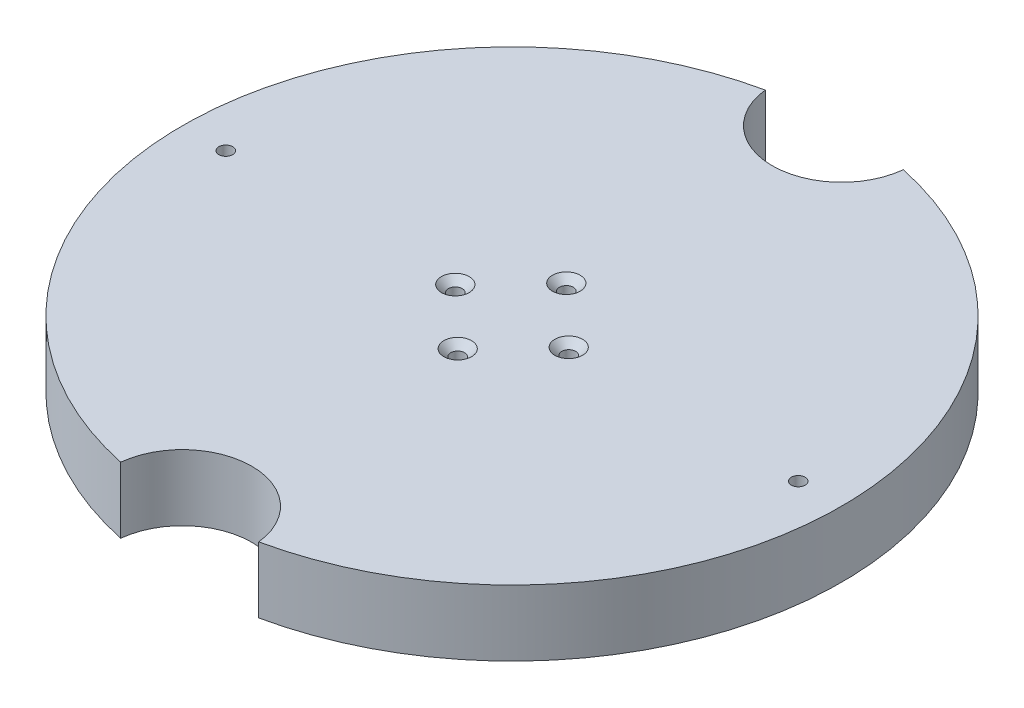
ISO-10303-21;
HEADER;
FILE_DESCRIPTION(('STEP AP214'),'2;1');
FILE_NAME('part.step','',(''),(''),'','','');
FILE_SCHEMA(('AUTOMOTIVE_DESIGN { 1 0 10303 214 1 1 1 1 }'));
ENDSEC;
DATA;
#1=APPLICATION_CONTEXT('core data for automotive mechanical design processes');
#2=APPLICATION_PROTOCOL_DEFINITION('international standard','automotive_design',2000,#1);
#3=PRODUCT_CONTEXT('',#1,'mechanical');
#4=PRODUCT('Part','Part','',(#3));
#5=PRODUCT_RELATED_PRODUCT_CATEGORY('part','',(#4));
#6=PRODUCT_DEFINITION_FORMATION('','',#4);
#7=PRODUCT_DEFINITION_CONTEXT('part definition',#1,'design');
#8=PRODUCT_DEFINITION('design','',#6,#7);
#9=PRODUCT_DEFINITION_SHAPE('','',#8);
#10=(LENGTH_UNIT() NAMED_UNIT(*) SI_UNIT(.MILLI.,.METRE.));
#11=(NAMED_UNIT(*) PLANE_ANGLE_UNIT() SI_UNIT($,.RADIAN.));
#12=(NAMED_UNIT(*) SI_UNIT($,.STERADIAN.) SOLID_ANGLE_UNIT());
#13=UNCERTAINTY_MEASURE_WITH_UNIT(LENGTH_MEASURE(1.E-05),#10,'distance_accuracy_value','');
#14=(GEOMETRIC_REPRESENTATION_CONTEXT(3) GLOBAL_UNCERTAINTY_ASSIGNED_CONTEXT((#13)) GLOBAL_UNIT_ASSIGNED_CONTEXT((#10,
#11,#12)) REPRESENTATION_CONTEXT('',''));
#15=CARTESIAN_POINT('',(0.,0.,0.));
#16=DIRECTION('',(0.,0.,1.));
#17=DIRECTION('',(1.,0.,0.));
#18=AXIS2_PLACEMENT_3D('',#15,#16,#17);
#19=CARTESIAN_POINT('',(0.,9.5,0.));
#20=DIRECTION('',(0.,-1.,0.));
#21=DIRECTION('',(0.,0.,-1.));
#22=AXIS2_PLACEMENT_3D('',#19,#20,#21);
#23=CYLINDRICAL_SURFACE('',#22,47.5);
#24=DIRECTION('',(0.,1.,0.));
#25=VECTOR('',#24,1.);
#26=CARTESIAN_POINT('',(-9.9444440145743,4.75,46.4473684210526));
#27=LINE('',#26,#25);
#28=CARTESIAN_POINT('',(-9.94444401457429,9.5,46.4473684210526));
#29=VERTEX_POINT('',#28);
#30=CARTESIAN_POINT('',(-9.94444401457432,0.,46.4473684210526));
#31=VERTEX_POINT('',#30);
#32=EDGE_CURVE('E57',#29,#31,#27,.F.);
#33=ORIENTED_EDGE('',*,*,#32,.F.);
#34=CARTESIAN_POINT('',(0.,9.5,0.));
#35=DIRECTION('',(0.,1.,0.));
#36=DIRECTION('',(0.,0.,1.));
#37=AXIS2_PLACEMENT_3D('',#34,#35,#36);
#38=CIRCLE('',#37,47.5);
#39=CARTESIAN_POINT('',(-9.94444401457429,9.5,-46.4473684210526));
#40=VERTEX_POINT('',#39);
#41=EDGE_CURVE('E111',#40,#29,#38,.T.);
#42=ORIENTED_EDGE('',*,*,#41,.F.);
#43=DIRECTION('',(0.,1.,0.));
#44=VECTOR('',#43,1.);
#45=CARTESIAN_POINT('',(-9.9444440145743,4.75,-46.4473684210526));
#46=LINE('',#45,#44);
#47=CARTESIAN_POINT('',(-9.94444401457429,0.,-46.4473684210526));
#48=VERTEX_POINT('',#47);
#49=EDGE_CURVE('E107',#40,#48,#46,.F.);
#50=ORIENTED_EDGE('',*,*,#49,.T.);
#51=CARTESIAN_POINT('',(0.,0.,0.));
#52=DIRECTION('',(0.,1.,0.));
#53=DIRECTION('',(0.,0.,1.));
#54=AXIS2_PLACEMENT_3D('',#51,#52,#53);
#55=CIRCLE('',#54,47.5);
#56=EDGE_CURVE('E102',#48,#31,#55,.T.);
#57=ORIENTED_EDGE('',*,*,#56,.T.);
#58=EDGE_LOOP('',(#33,#42,#50,#57));
#59=FACE_BOUND('',#58,.T.);
#60=ADVANCED_FACE('F40',(#59),#23,.T.);
#61=DIRECTION('',(0.,1.,0.));
#62=VECTOR('',#61,1.);
#63=CARTESIAN_POINT('',(9.9444440145743,4.75,46.4473684210526));
#64=LINE('',#63,#62);
#65=CARTESIAN_POINT('',(9.94444401457429,0.,46.4473684210526));
#66=VERTEX_POINT('',#65);
#67=CARTESIAN_POINT('',(9.94444401457429,9.5,46.4473684210526));
#68=VERTEX_POINT('',#67);
#69=EDGE_CURVE('E84',#66,#68,#64,.T.);
#70=ORIENTED_EDGE('',*,*,#69,.F.);
#71=CARTESIAN_POINT('',(9.94444401457432,0.,-46.4473684210526));
#72=VERTEX_POINT('',#71);
#73=EDGE_CURVE('E65',#66,#72,#55,.T.);
#74=ORIENTED_EDGE('',*,*,#73,.T.);
#75=DIRECTION('',(0.,1.,0.));
#76=VECTOR('',#75,1.);
#77=CARTESIAN_POINT('',(9.9444440145743,4.75,-46.4473684210526));
#78=LINE('',#77,#76);
#79=CARTESIAN_POINT('',(9.94444401457429,9.5,-46.4473684210526));
#80=VERTEX_POINT('',#79);
#81=EDGE_CURVE('E103',#72,#80,#78,.T.);
#82=ORIENTED_EDGE('',*,*,#81,.T.);
#83=EDGE_CURVE('E95',#68,#80,#38,.T.);
#84=ORIENTED_EDGE('',*,*,#83,.F.);
#85=EDGE_LOOP('',(#70,#74,#82,#84));
#86=FACE_BOUND('',#85,.T.);
#87=ADVANCED_FACE('F94',(#86),#23,.T.);
#88=CARTESIAN_POINT('',(0.,9.5,0.));
#89=DIRECTION('',(0.,1.,0.));
#90=DIRECTION('',(0.,0.,1.));
#91=AXIS2_PLACEMENT_3D('',#88,#89,#90);
#92=PLANE('',#91);
#93=CARTESIAN_POINT('',(41.25,9.5,0.));
#94=DIRECTION('',(0.,-1.,0.));
#95=DIRECTION('',(0.,0.,1.));
#96=AXIS2_PLACEMENT_3D('',#93,#94,#95);
#97=CIRCLE('',#96,0.999999999999998);
#98=CARTESIAN_POINT('',(41.25,9.5,0.999999999999998));
#99=VERTEX_POINT('',#98);
#100=EDGE_CURVE('E242',#99,#99,#97,.T.);
#101=ORIENTED_EDGE('',*,*,#100,.T.);
#102=EDGE_LOOP('',(#101));
#103=FACE_BOUND('',#102,.T.);
#104=CARTESIAN_POINT('',(-41.25,9.5,0.));
#105=DIRECTION('',(0.,1.,0.));
#106=DIRECTION('',(0.,0.,1.));
#107=AXIS2_PLACEMENT_3D('',#104,#105,#106);
#108=CIRCLE('',#107,0.999999999999998);
#109=CARTESIAN_POINT('',(-41.25,9.5,0.999999999999998));
#110=VERTEX_POINT('',#109);
#111=EDGE_CURVE('E119',#110,#110,#108,.T.);
#112=ORIENTED_EDGE('',*,*,#111,.F.);
#113=EDGE_LOOP('',(#112));
#114=FACE_BOUND('',#113,.T.);
#115=CARTESIAN_POINT('',(-7.99813720015753,9.5,0.172630609847427));
#116=DIRECTION('',(0.,1.,0.));
#117=DIRECTION('',(0.,0.,1.));
#118=AXIS2_PLACEMENT_3D('',#115,#116,#117);
#119=CIRCLE('',#118,2.00000000000006);
#120=CARTESIAN_POINT('',(-7.99813720015753,9.5,2.17263060984749));
#121=VERTEX_POINT('',#120);
#122=EDGE_CURVE('E146',#121,#121,#119,.F.);
#123=ORIENTED_EDGE('',*,*,#122,.T.);
#124=EDGE_LOOP('',(#123));
#125=FACE_BOUND('',#124,.T.);
#126=CARTESIAN_POINT('',(0.172630609847433,9.5,7.99813720015753));
#127=DIRECTION('',(0.,1.,0.));
#128=DIRECTION('',(0.,0.,1.));
#129=AXIS2_PLACEMENT_3D('',#126,#127,#128);
#130=CIRCLE('',#129,2.00000000000003);
#131=CARTESIAN_POINT('',(0.172630609847433,9.5,9.99813720015756));
#132=VERTEX_POINT('',#131);
#133=EDGE_CURVE('E142',#132,#132,#130,.F.);
#134=ORIENTED_EDGE('',*,*,#133,.T.);
#135=EDGE_LOOP('',(#134));
#136=FACE_BOUND('',#135,.T.);
#137=CARTESIAN_POINT('',(7.99813720015753,9.5,-0.172630609847428));
#138=DIRECTION('',(0.,1.,0.));
#139=DIRECTION('',(0.,0.,1.));
#140=AXIS2_PLACEMENT_3D('',#137,#138,#139);
#141=CIRCLE('',#140,1.99999999999997);
#142=CARTESIAN_POINT('',(7.99813720015753,9.5,1.82736939015255));
#143=VERTEX_POINT('',#142);
#144=EDGE_CURVE('E138',#143,#143,#141,.F.);
#145=ORIENTED_EDGE('',*,*,#144,.T.);
#146=EDGE_LOOP('',(#145));
#147=FACE_BOUND('',#146,.T.);
#148=CARTESIAN_POINT('',(-0.172630609847428,9.5,-7.99813720015753));
#149=DIRECTION('',(0.,1.,0.));
#150=DIRECTION('',(0.,0.,1.));
#151=AXIS2_PLACEMENT_3D('',#148,#149,#150);
#152=CIRCLE('',#151,2.00000000000004);
#153=CARTESIAN_POINT('',(-0.172630609847428,9.5,-5.99813720015749));
#154=VERTEX_POINT('',#153);
#155=EDGE_CURVE('E134',#154,#154,#152,.F.);
#156=ORIENTED_EDGE('',*,*,#155,.T.);
#157=EDGE_LOOP('',(#156));
#158=FACE_BOUND('',#157,.T.);
#159=ORIENTED_EDGE('',*,*,#41,.T.);
#160=CARTESIAN_POINT('',(0.,9.5,47.5));
#161=DIRECTION('',(0.,-1.,0.));
#162=DIRECTION('',(0.,0.,-1.));
#163=AXIS2_PLACEMENT_3D('',#160,#161,#162);
#164=CIRCLE('',#163,9.99999999999999);
#165=EDGE_CURVE('E97',#29,#68,#164,.T.);
#166=ORIENTED_EDGE('',*,*,#165,.T.);
#167=ORIENTED_EDGE('',*,*,#83,.T.);
#168=CARTESIAN_POINT('',(0.,9.5,-47.5));
#169=DIRECTION('',(0.,1.,0.));
#170=DIRECTION('',(0.,0.,1.));
#171=AXIS2_PLACEMENT_3D('',#168,#169,#170);
#172=CIRCLE('',#171,9.99999999999999);
#173=EDGE_CURVE('E252',#40,#80,#172,.T.);
#174=ORIENTED_EDGE('',*,*,#173,.F.);
#175=EDGE_LOOP('',(#159,#166,#167,#174));
#176=FACE_BOUND('',#175,.T.);
#177=ADVANCED_FACE('F191',(#103,#114,#125,#136,#147,#158,#176),#92,.T.);
#178=CARTESIAN_POINT('',(0.,0.,0.));
#179=DIRECTION('',(0.,1.,0.));
#180=DIRECTION('',(0.,0.,1.));
#181=AXIS2_PLACEMENT_3D('',#178,#179,#180);
#182=PLANE('',#181);
#183=CARTESIAN_POINT('',(41.25,0.,0.));
#184=DIRECTION('',(0.,1.,0.));
#185=DIRECTION('',(0.,0.,1.));
#186=AXIS2_PLACEMENT_3D('',#183,#184,#185);
#187=CIRCLE('',#186,2.00000000000002);
#188=CARTESIAN_POINT('',(41.25,0.,2.00000000000002));
#189=VERTEX_POINT('',#188);
#190=EDGE_CURVE('E50',#189,#189,#187,.T.);
#191=ORIENTED_EDGE('',*,*,#190,.T.);
#192=EDGE_LOOP('',(#191));
#193=FACE_BOUND('',#192,.T.);
#194=CARTESIAN_POINT('',(-41.25,0.,0.));
#195=DIRECTION('',(0.,1.,0.));
#196=DIRECTION('',(0.,0.,1.));
#197=AXIS2_PLACEMENT_3D('',#194,#195,#196);
#198=CIRCLE('',#197,2.00000000000002);
#199=CARTESIAN_POINT('',(-41.25,0.,2.00000000000002));
#200=VERTEX_POINT('',#199);
#201=EDGE_CURVE('E166',#200,#200,#198,.T.);
#202=ORIENTED_EDGE('',*,*,#201,.T.);
#203=EDGE_LOOP('',(#202));
#204=FACE_BOUND('',#203,.T.);
#205=CARTESIAN_POINT('',(-7.99813720015753,0.,0.172630609847426));
#206=DIRECTION('',(0.,1.,0.));
#207=DIRECTION('',(0.,0.,1.));
#208=AXIS2_PLACEMENT_3D('',#205,#206,#207);
#209=CIRCLE('',#208,1.);
#210=CARTESIAN_POINT('',(-8.97198100407393,0.,-0.0545878875810159));
#211=VERTEX_POINT('',#210);
#212=EDGE_CURVE('E127',#211,#211,#209,.T.);
#213=ORIENTED_EDGE('',*,*,#212,.T.);
#214=EDGE_LOOP('',(#213));
#215=FACE_BOUND('',#214,.T.);
#216=CARTESIAN_POINT('',(-0.172630609847428,0.,-7.99813720015753));
#217=DIRECTION('',(0.,1.,0.));
#218=DIRECTION('',(0.,0.,1.));
#219=AXIS2_PLACEMENT_3D('',#216,#217,#218);
#220=CIRCLE('',#219,1.);
#221=CARTESIAN_POINT('',(-0.172630609847428,0.,-6.99813720015753));
#222=VERTEX_POINT('',#221);
#223=EDGE_CURVE('E123',#222,#222,#220,.T.);
#224=ORIENTED_EDGE('',*,*,#223,.T.);
#225=EDGE_LOOP('',(#224));
#226=FACE_BOUND('',#225,.T.);
#227=CARTESIAN_POINT('',(0.172630609847433,0.,7.99813720015753));
#228=DIRECTION('',(0.,1.,0.));
#229=DIRECTION('',(0.,0.,1.));
#230=AXIS2_PLACEMENT_3D('',#227,#228,#229);
#231=CIRCLE('',#230,1.);
#232=CARTESIAN_POINT('',(0.172630609847433,0.,8.99813720015753));
#233=VERTEX_POINT('',#232);
#234=EDGE_CURVE('E118',#233,#233,#231,.T.);
#235=ORIENTED_EDGE('',*,*,#234,.T.);
#236=EDGE_LOOP('',(#235));
#237=FACE_BOUND('',#236,.T.);
#238=CARTESIAN_POINT('',(7.99813720015753,0.,-0.172630609847428));
#239=DIRECTION('',(0.,1.,0.));
#240=DIRECTION('',(0.,0.,1.));
#241=AXIS2_PLACEMENT_3D('',#238,#239,#240);
#242=CIRCLE('',#241,1.);
#243=CARTESIAN_POINT('',(7.99813720015753,0.,0.827369390152572));
#244=VERTEX_POINT('',#243);
#245=EDGE_CURVE('E114',#244,#244,#242,.T.);
#246=ORIENTED_EDGE('',*,*,#245,.T.);
#247=EDGE_LOOP('',(#246));
#248=FACE_BOUND('',#247,.T.);
#249=CARTESIAN_POINT('',(0.,0.,47.5));
#250=DIRECTION('',(0.,1.,0.));
#251=DIRECTION('',(0.,0.,1.));
#252=AXIS2_PLACEMENT_3D('',#249,#250,#251);
#253=CIRCLE('',#252,9.99999999999999);
#254=EDGE_CURVE('E82',#31,#66,#253,.F.);
#255=ORIENTED_EDGE('',*,*,#254,.F.);
#256=ORIENTED_EDGE('',*,*,#56,.F.);
#257=CARTESIAN_POINT('',(0.,0.,-47.5));
#258=DIRECTION('',(0.,1.,0.));
#259=DIRECTION('',(0.,0.,1.));
#260=AXIS2_PLACEMENT_3D('',#257,#258,#259);
#261=CIRCLE('',#260,9.99999999999999);
#262=EDGE_CURVE('E91',#48,#72,#261,.T.);
#263=ORIENTED_EDGE('',*,*,#262,.T.);
#264=ORIENTED_EDGE('',*,*,#73,.F.);
#265=EDGE_LOOP('',(#255,#256,#263,#264));
#266=FACE_BOUND('',#265,.T.);
#267=ADVANCED_FACE('F100',(#193,#204,#215,#226,#237,#248,#266),#182,.F.);
#268=CARTESIAN_POINT('',(0.,-22.3606797749979,-47.5));
#269=DIRECTION('',(0.,1.,0.));
#270=DIRECTION('',(0.,0.,1.));
#271=AXIS2_PLACEMENT_3D('',#268,#269,#270);
#272=CYLINDRICAL_SURFACE('',#271,9.99999999999999);
#273=ORIENTED_EDGE('',*,*,#262,.F.);
#274=ORIENTED_EDGE('',*,*,#49,.F.);
#275=ORIENTED_EDGE('',*,*,#173,.T.);
#276=ORIENTED_EDGE('',*,*,#81,.F.);
#277=EDGE_LOOP('',(#273,#274,#275,#276));
#278=FACE_BOUND('',#277,.T.);
#279=ADVANCED_FACE('F262',(#278),#272,.F.);
#280=CARTESIAN_POINT('',(0.,-22.3606797749979,47.5));
#281=DIRECTION('',(0.,1.,0.));
#282=DIRECTION('',(0.,0.,1.));
#283=AXIS2_PLACEMENT_3D('',#280,#281,#282);
#284=CYLINDRICAL_SURFACE('',#283,9.99999999999999);
#285=ORIENTED_EDGE('',*,*,#32,.T.);
#286=ORIENTED_EDGE('',*,*,#254,.T.);
#287=ORIENTED_EDGE('',*,*,#69,.T.);
#288=ORIENTED_EDGE('',*,*,#165,.F.);
#289=EDGE_LOOP('',(#285,#286,#287,#288));
#290=FACE_BOUND('',#289,.T.);
#291=ADVANCED_FACE('F83',(#290),#284,.F.);
#292=CARTESIAN_POINT('',(7.99813720015753,36.5,-0.172630609847428));
#293=DIRECTION('',(0.,1.,0.));
#294=DIRECTION('',(-0.918677243722428,0.,-0.395009014918093));
#295=AXIS2_PLACEMENT_3D('',#292,#293,#294);
#296=CYLINDRICAL_SURFACE('',#295,1.);
#297=CARTESIAN_POINT('',(7.99813720015753,8.50000000000002,-0.172630609847428));
#298=DIRECTION('',(0.,1.,0.));
#299=DIRECTION('',(0.,0.,1.));
#300=AXIS2_PLACEMENT_3D('',#297,#298,#299);
#301=CIRCLE('',#300,1.);
#302=CARTESIAN_POINT('',(7.99813720015753,8.50000000000002,0.827369390152572));
#303=VERTEX_POINT('',#302);
#304=EDGE_CURVE('E154',#303,#303,#301,.T.);
#305=ORIENTED_EDGE('',*,*,#304,.T.);
#306=EDGE_LOOP('',(#305));
#307=FACE_BOUND('',#306,.T.);
#308=ORIENTED_EDGE('',*,*,#245,.F.);
#309=EDGE_LOOP('',(#308));
#310=FACE_BOUND('',#309,.T.);
#311=ADVANCED_FACE('F276',(#307,#310),#296,.F.);
#312=CARTESIAN_POINT('',(0.172630609847432,36.5,7.99813720015753));
#313=DIRECTION('',(0.,1.,0.));
#314=DIRECTION('',(-0.0183456748203902,0.,0.999831703945911));
#315=AXIS2_PLACEMENT_3D('',#312,#313,#314);
#316=CYLINDRICAL_SURFACE('',#315,1.);
#317=CARTESIAN_POINT('',(0.172630609847433,8.49999999999997,7.99813720015753));
#318=DIRECTION('',(0.,1.,0.));
#319=DIRECTION('',(0.,0.,1.));
#320=AXIS2_PLACEMENT_3D('',#317,#318,#319);
#321=CIRCLE('',#320,1.);
#322=CARTESIAN_POINT('',(0.172630609847433,8.49999999999997,8.99813720015753));
#323=VERTEX_POINT('',#322);
#324=EDGE_CURVE('E150',#323,#323,#321,.T.);
#325=ORIENTED_EDGE('',*,*,#324,.T.);
#326=EDGE_LOOP('',(#325));
#327=FACE_BOUND('',#326,.T.);
#328=ORIENTED_EDGE('',*,*,#234,.F.);
#329=EDGE_LOOP('',(#328));
#330=FACE_BOUND('',#329,.T.);
#331=ADVANCED_FACE('F279',(#327,#330),#316,.F.);
#332=CARTESIAN_POINT('',(-0.172630609847427,36.5,-7.99813720015753));
#333=DIRECTION('',(0.,1.,0.));
#334=DIRECTION('',(-0.840683119403676,0.,0.541527370268304));
#335=AXIS2_PLACEMENT_3D('',#332,#333,#334);
#336=CYLINDRICAL_SURFACE('',#335,1.);
#337=CARTESIAN_POINT('',(-0.172630609847428,8.49999999999997,-7.99813720015753));
#338=DIRECTION('',(0.,1.,0.));
#339=DIRECTION('',(-1.,0.,0.));
#340=AXIS2_PLACEMENT_3D('',#337,#338,#339);
#341=CIRCLE('',#340,1.);
#342=CARTESIAN_POINT('',(-1.17263060984743,8.49999999999997,-7.99813720015753));
#343=VERTEX_POINT('',#342);
#344=EDGE_CURVE('E158',#343,#343,#341,.T.);
#345=ORIENTED_EDGE('',*,*,#344,.T.);
#346=EDGE_LOOP('',(#345));
#347=FACE_BOUND('',#346,.T.);
#348=ORIENTED_EDGE('',*,*,#223,.F.);
#349=EDGE_LOOP('',(#348));
#350=FACE_BOUND('',#349,.T.);
#351=ADVANCED_FACE('F283',(#347,#350),#336,.F.);
#352=CARTESIAN_POINT('',(-7.99813720015753,36.5,0.17263060984743));
#353=DIRECTION('',(0.,1.,0.));
#354=DIRECTION('',(-0.973843803916398,0.,-0.227218497428442));
#355=AXIS2_PLACEMENT_3D('',#352,#353,#354);
#356=CYLINDRICAL_SURFACE('',#355,1.);
#357=CARTESIAN_POINT('',(-7.99813720015753,8.49999999999994,0.172630609847427));
#358=DIRECTION('',(0.,1.,0.));
#359=DIRECTION('',(0.,0.,1.));
#360=AXIS2_PLACEMENT_3D('',#357,#358,#359);
#361=CIRCLE('',#360,1.);
#362=CARTESIAN_POINT('',(-8.97198100407393,8.49999999999994,-0.054587887581015));
#363=VERTEX_POINT('',#362);
#364=EDGE_CURVE('E90',#363,#363,#361,.T.);
#365=CARTESIAN_POINT('',(-8.97198100407393,8.49999999999994,-0.054587887581015));
#366=CARTESIAN_POINT('',(-8.97198100407393,8.41145833333328,-0.054587887581015));
#367=CARTESIAN_POINT('',(-8.97198100407393,8.32291666666661,-0.054587887581015));
#368=CARTESIAN_POINT('',(-8.97198100407393,8.14583333333328,-0.054587887581015));
#369=CARTESIAN_POINT('',(-8.97198100407393,8.05729166666661,-0.0545878875810151));
#370=CARTESIAN_POINT('',(-8.97198100407393,7.88020833333328,-0.0545878875810151));
#371=CARTESIAN_POINT('',(-8.97198100407393,7.79166666666661,-0.0545878875810151));
#372=CARTESIAN_POINT('',(-8.97198100407393,7.61458333333328,-0.0545878875810151));
#373=CARTESIAN_POINT('',(-8.97198100407393,7.52604166666661,-0.0545878875810151));
#374=CARTESIAN_POINT('',(-8.97198100407393,7.34895833333328,-0.0545878875810151));
#375=CARTESIAN_POINT('',(-8.97198100407393,7.26041666666662,-0.0545878875810151));
#376=CARTESIAN_POINT('',(-8.97198100407393,7.08333333333328,-0.0545878875810152));
#377=CARTESIAN_POINT('',(-8.97198100407393,6.99479166666662,-0.0545878875810152));
#378=CARTESIAN_POINT('',(-8.97198100407393,6.81770833333328,-0.0545878875810152));
#379=CARTESIAN_POINT('',(-8.97198100407393,6.72916666666662,-0.0545878875810152));
#380=CARTESIAN_POINT('',(-8.97198100407393,6.55208333333329,-0.0545878875810152));
#381=CARTESIAN_POINT('',(-8.97198100407393,6.46354166666662,-0.0545878875810152));
#382=CARTESIAN_POINT('',(-8.97198100407393,6.28645833333329,-0.0545878875810152));
#383=CARTESIAN_POINT('',(-8.97198100407393,6.19791666666662,-0.0545878875810152));
#384=CARTESIAN_POINT('',(-8.97198100407393,6.02083333333329,-0.0545878875810153));
#385=CARTESIAN_POINT('',(-8.97198100407393,5.93229166666663,-0.0545878875810153));
#386=CARTESIAN_POINT('',(-8.97198100407393,5.75520833333329,-0.0545878875810153));
#387=CARTESIAN_POINT('',(-8.97198100407393,5.66666666666663,-0.0545878875810153));
#388=CARTESIAN_POINT('',(-8.97198100407393,5.48958333333329,-0.0545878875810153));
#389=CARTESIAN_POINT('',(-8.97198100407393,5.40104166666663,-0.0545878875810153));
#390=CARTESIAN_POINT('',(-8.97198100407393,5.2239583333333,-0.0545878875810153));
#391=CARTESIAN_POINT('',(-8.97198100407393,5.13541666666663,-0.0545878875810154));
#392=CARTESIAN_POINT('',(-8.97198100407393,4.9583333333333,-0.0545878875810154));
#393=CARTESIAN_POINT('',(-8.97198100407393,4.86979166666663,-0.0545878875810154));
#394=CARTESIAN_POINT('',(-8.97198100407393,4.6927083333333,-0.0545878875810154));
#395=CARTESIAN_POINT('',(-8.97198100407393,4.60416666666663,-0.0545878875810154));
#396=CARTESIAN_POINT('',(-8.97198100407393,4.4270833333333,-0.0545878875810154));
#397=CARTESIAN_POINT('',(-8.97198100407393,4.33854166666664,-0.0545878875810154));
#398=CARTESIAN_POINT('',(-8.97198100407393,4.16145833333331,-0.0545878875810155));
#399=CARTESIAN_POINT('',(-8.97198100407393,4.07291666666664,-0.0545878875810155));
#400=CARTESIAN_POINT('',(-8.97198100407393,3.89583333333331,-0.0545878875810155));
#401=CARTESIAN_POINT('',(-8.97198100407393,3.80729166666664,-0.0545878875810155));
#402=CARTESIAN_POINT('',(-8.97198100407393,3.63020833333331,-0.0545878875810155));
#403=CARTESIAN_POINT('',(-8.97198100407393,3.54166666666665,-0.0545878875810155));
#404=CARTESIAN_POINT('',(-8.97198100407393,3.36458333333331,-0.0545878875810155));
#405=CARTESIAN_POINT('',(-8.97198100407393,3.27604166666665,-0.0545878875810155));
#406=CARTESIAN_POINT('',(-8.97198100407393,3.09895833333332,-0.0545878875810156));
#407=CARTESIAN_POINT('',(-8.97198100407393,3.01041666666665,-0.0545878875810156));
#408=CARTESIAN_POINT('',(-8.97198100407393,2.83333333333332,-0.0545878875810156));
#409=CARTESIAN_POINT('',(-8.97198100407393,2.74479166666665,-0.0545878875810156));
#410=CARTESIAN_POINT('',(-8.97198100407393,2.56770833333332,-0.0545878875810156));
#411=CARTESIAN_POINT('',(-8.97198100407393,2.47916666666665,-0.0545878875810156));
#412=CARTESIAN_POINT('',(-8.97198100407393,2.30208333333332,-0.0545878875810156));
#413=CARTESIAN_POINT('',(-8.97198100407393,2.21354166666665,-0.0545878875810157));
#414=CARTESIAN_POINT('',(-8.97198100407393,2.03645833333332,-0.0545878875810157));
#415=CARTESIAN_POINT('',(-8.97198100407393,1.94791666666666,-0.0545878875810157));
#416=CARTESIAN_POINT('',(-8.97198100407393,1.77083333333332,-0.0545878875810157));
#417=CARTESIAN_POINT('',(-8.97198100407393,1.68229166666666,-0.0545878875810157));
#418=CARTESIAN_POINT('',(-8.97198100407393,1.50520833333332,-0.0545878875810157));
#419=CARTESIAN_POINT('',(-8.97198100407393,1.41666666666666,-0.0545878875810157));
#420=CARTESIAN_POINT('',(-8.97198100407393,1.23958333333333,-0.0545878875810158));
#421=CARTESIAN_POINT('',(-8.97198100407393,1.15104166666666,-0.0545878875810158));
#422=CARTESIAN_POINT('',(-8.97198100407393,0.973958333333328,-0.0545878875810158));
#423=CARTESIAN_POINT('',(-8.97198100407393,0.885416666666662,-0.0545878875810158));
#424=CARTESIAN_POINT('',(-8.97198100407393,0.708333333333329,-0.0545878875810158));
#425=CARTESIAN_POINT('',(-8.97198100407393,0.619791666666663,-0.0545878875810158));
#426=CARTESIAN_POINT('',(-8.97198100407393,0.442708333333331,-0.0545878875810158));
#427=CARTESIAN_POINT('',(-8.97198100407393,0.354166666666665,-0.0545878875810158));
#428=CARTESIAN_POINT('',(-8.97198100407393,0.177083333333332,-0.0545878875810158));
#429=CARTESIAN_POINT('',(-8.97198100407393,0.0885416666666662,-0.0545878875810159));
#430=CARTESIAN_POINT('',(-8.97198100407393,0.,-0.0545878875810159));
#431=B_SPLINE_CURVE_WITH_KNOTS('',3,(#365,#366,#367,#368,#369,#370,#371,#372,#373,#374,#375,
#376,#377,#378,#379,#380,#381,#382,#383,#384,#385,#386,#387,#388,#389,#390,#391,#392,#393,#394,
#395,#396,#397,#398,#399,#400,#401,#402,#403,#404,#405,#406,#407,#408,#409,#410,#411,#412,#413,
#414,#415,#416,#417,#418,#419,#420,#421,#422,#423,#424,#425,#426,#427,#428,#429,#430),
.UNSPECIFIED.,.F.,.F.,(4,2,2,2,2,2,2,2,2,2,2,2,2,2,2,2,2,2,2,2,2,2,2,2,2,2,2,2,2,2,2,2,4),(0.,
0.265624999999999,0.531249999999997,0.796874999999996,1.06249999999999,1.32812499999999,
1.59374999999999,1.85937499999999,2.12499999999999,2.39062499999999,2.65624999999998,
2.92187499999998,3.18749999999998,3.45312499999998,3.71874999999998,3.98437499999997,
4.24999999999997,4.51562499999997,4.78124999999996,5.04687499999996,5.31249999999996,
5.57812499999996,5.84374999999996,6.10937499999995,6.37499999999995,6.64062499999995,
6.90624999999995,7.17187499999995,7.43749999999995,7.70312499999995,7.96874999999994,
8.23437499999994,8.49999999999994),.UNSPECIFIED.);
#432=EDGE_CURVE('BSEAM203',#363,#211,#431,.T.);
#433=ORIENTED_EDGE('',*,*,#364,.T.);
#434=ORIENTED_EDGE('',*,*,#212,.F.);
#435=ORIENTED_EDGE('',*,*,#432,.T.);
#436=ORIENTED_EDGE('',*,*,#432,.F.);
#437=EDGE_LOOP('',(#433,#435,#434,#436));
#438=FACE_BOUND('',#437,.T.);
#439=ADVANCED_FACE('F203',(#438),#356,.F.);
#440=CARTESIAN_POINT('',(-7.99813720015753,8.49999999999994,0.172630609847427));
#441=DIRECTION('',(0.,1.,0.));
#442=DIRECTION('',(0.,0.,1.));
#443=AXIS2_PLACEMENT_3D('',#440,#441,#442);
#444=CONICAL_SURFACE('',#443,1.,0.785398163397446);
#445=ORIENTED_EDGE('',*,*,#122,.F.);
#446=EDGE_LOOP('',(#445));
#447=FACE_BOUND('',#446,.T.);
#448=ORIENTED_EDGE('',*,*,#364,.F.);
#449=EDGE_LOOP('',(#448));
#450=FACE_BOUND('',#449,.T.);
#451=ADVANCED_FACE('F196',(#447,#450),#444,.F.);
#452=CARTESIAN_POINT('',(0.172630609847433,8.49999999999997,7.99813720015753));
#453=DIRECTION('',(0.,1.,0.));
#454=DIRECTION('',(0.,0.,1.));
#455=AXIS2_PLACEMENT_3D('',#452,#453,#454);
#456=CONICAL_SURFACE('',#455,1.,0.785398163397448);
#457=ORIENTED_EDGE('',*,*,#133,.F.);
#458=EDGE_LOOP('',(#457));
#459=FACE_BOUND('',#458,.T.);
#460=ORIENTED_EDGE('',*,*,#324,.F.);
#461=EDGE_LOOP('',(#460));
#462=FACE_BOUND('',#461,.T.);
#463=ADVANCED_FACE('F202',(#459,#462),#456,.F.);
#464=CARTESIAN_POINT('',(7.99813720015753,8.50000000000002,-0.172630609847428));
#465=DIRECTION('',(0.,1.,0.));
#466=DIRECTION('',(0.,0.,1.));
#467=AXIS2_PLACEMENT_3D('',#464,#465,#466);
#468=CONICAL_SURFACE('',#467,1.,0.785398163397446);
#469=ORIENTED_EDGE('',*,*,#144,.F.);
#470=EDGE_LOOP('',(#469));
#471=FACE_BOUND('',#470,.T.);
#472=ORIENTED_EDGE('',*,*,#304,.F.);
#473=EDGE_LOOP('',(#472));
#474=FACE_BOUND('',#473,.T.);
#475=ADVANCED_FACE('F210',(#471,#474),#468,.F.);
#476=CARTESIAN_POINT('',(-0.172630609847428,8.49999999999997,-7.99813720015753));
#477=DIRECTION('',(0.,1.,0.));
#478=DIRECTION('',(-1.,0.,0.));
#479=AXIS2_PLACEMENT_3D('',#476,#477,#478);
#480=CONICAL_SURFACE('',#479,1.,0.785398163397449);
#481=ORIENTED_EDGE('',*,*,#155,.F.);
#482=EDGE_LOOP('',(#481));
#483=FACE_BOUND('',#482,.T.);
#484=ORIENTED_EDGE('',*,*,#344,.F.);
#485=EDGE_LOOP('',(#484));
#486=FACE_BOUND('',#485,.T.);
#487=ADVANCED_FACE('F217',(#483,#486),#480,.F.);
#488=CARTESIAN_POINT('',(-41.25,-2.82842712474619,0.));
#489=DIRECTION('',(0.,1.,0.));
#490=DIRECTION('',(0.,0.,1.));
#491=AXIS2_PLACEMENT_3D('',#488,#489,#490);
#492=CYLINDRICAL_SURFACE('',#491,0.999999999999998);
#493=CARTESIAN_POINT('',(-41.25,1.00000000000002,0.));
#494=DIRECTION('',(0.,1.,0.));
#495=DIRECTION('',(0.,0.,1.));
#496=AXIS2_PLACEMENT_3D('',#493,#494,#495);
#497=CIRCLE('',#496,0.999999999999998);
#498=CARTESIAN_POINT('',(-41.25,1.00000000000002,0.999999999999998));
#499=VERTEX_POINT('',#498);
#500=EDGE_CURVE('E162',#499,#499,#497,.F.);
#501=ORIENTED_EDGE('',*,*,#500,.T.);
#502=EDGE_LOOP('',(#501));
#503=FACE_BOUND('',#502,.T.);
#504=ORIENTED_EDGE('',*,*,#111,.T.);
#505=EDGE_LOOP('',(#504));
#506=FACE_BOUND('',#505,.T.);
#507=ADVANCED_FACE('F223',(#503,#506),#492,.F.);
#508=CARTESIAN_POINT('',(-41.25,1.00000000000002,0.));
#509=DIRECTION('',(0.,-1.,0.));
#510=DIRECTION('',(0.,0.,-1.));
#511=AXIS2_PLACEMENT_3D('',#508,#509,#510);
#512=CONICAL_SURFACE('',#511,0.999999999999998,0.785398163397447);
#513=ORIENTED_EDGE('',*,*,#201,.F.);
#514=EDGE_LOOP('',(#513));
#515=FACE_BOUND('',#514,.T.);
#516=ORIENTED_EDGE('',*,*,#500,.F.);
#517=EDGE_LOOP('',(#516));
#518=FACE_BOUND('',#517,.T.);
#519=ADVANCED_FACE('F181',(#515,#518),#512,.F.);
#520=CARTESIAN_POINT('',(41.25,-2.82842712474619,0.));
#521=DIRECTION('',(0.,1.,0.));
#522=DIRECTION('',(0.,0.,1.));
#523=AXIS2_PLACEMENT_3D('',#520,#521,#522);
#524=CYLINDRICAL_SURFACE('',#523,0.999999999999998);
#525=CARTESIAN_POINT('',(41.25,1.00000000000001,0.));
#526=DIRECTION('',(0.,1.,0.));
#527=DIRECTION('',(0.,0.,1.));
#528=AXIS2_PLACEMENT_3D('',#525,#526,#527);
#529=CIRCLE('',#528,0.999999999999998);
#530=CARTESIAN_POINT('',(41.25,1.00000000000001,0.999999999999998));
#531=VERTEX_POINT('',#530);
#532=EDGE_CURVE('E11',#531,#531,#529,.F.);
#533=ORIENTED_EDGE('',*,*,#532,.T.);
#534=EDGE_LOOP('',(#533));
#535=FACE_BOUND('',#534,.T.);
#536=ORIENTED_EDGE('',*,*,#100,.F.);
#537=EDGE_LOOP('',(#536));
#538=FACE_BOUND('',#537,.T.);
#539=ADVANCED_FACE('F176',(#535,#538),#524,.F.);
#540=CARTESIAN_POINT('',(41.25,0.,0.));
#541=DIRECTION('',(0.,-1.,0.));
#542=DIRECTION('',(0.,0.,-1.));
#543=AXIS2_PLACEMENT_3D('',#540,#541,#542);
#544=CONICAL_SURFACE('',#543,2.00000000000002,0.785398163397454);
#545=ORIENTED_EDGE('',*,*,#532,.F.);
#546=EDGE_LOOP('',(#545));
#547=FACE_BOUND('',#546,.T.);
#548=ORIENTED_EDGE('',*,*,#190,.F.);
#549=EDGE_LOOP('',(#548));
#550=FACE_BOUND('',#549,.T.);
#551=ADVANCED_FACE('F43',(#547,#550),#544,.F.);
#552=CLOSED_SHELL('',(#60,#87,#177,#267,#279,#291,#311,#331,#351,#439,#451,#463,#475,#487,#507,
#519,#539,#551));
#553=MANIFOLD_SOLID_BREP('B2',#552);
#554=ADVANCED_BREP_SHAPE_REPRESENTATION('',(#18,#553),#14);
#555=SHAPE_DEFINITION_REPRESENTATION(#9,#554);
ENDSEC;
END-ISO-10303-21;
